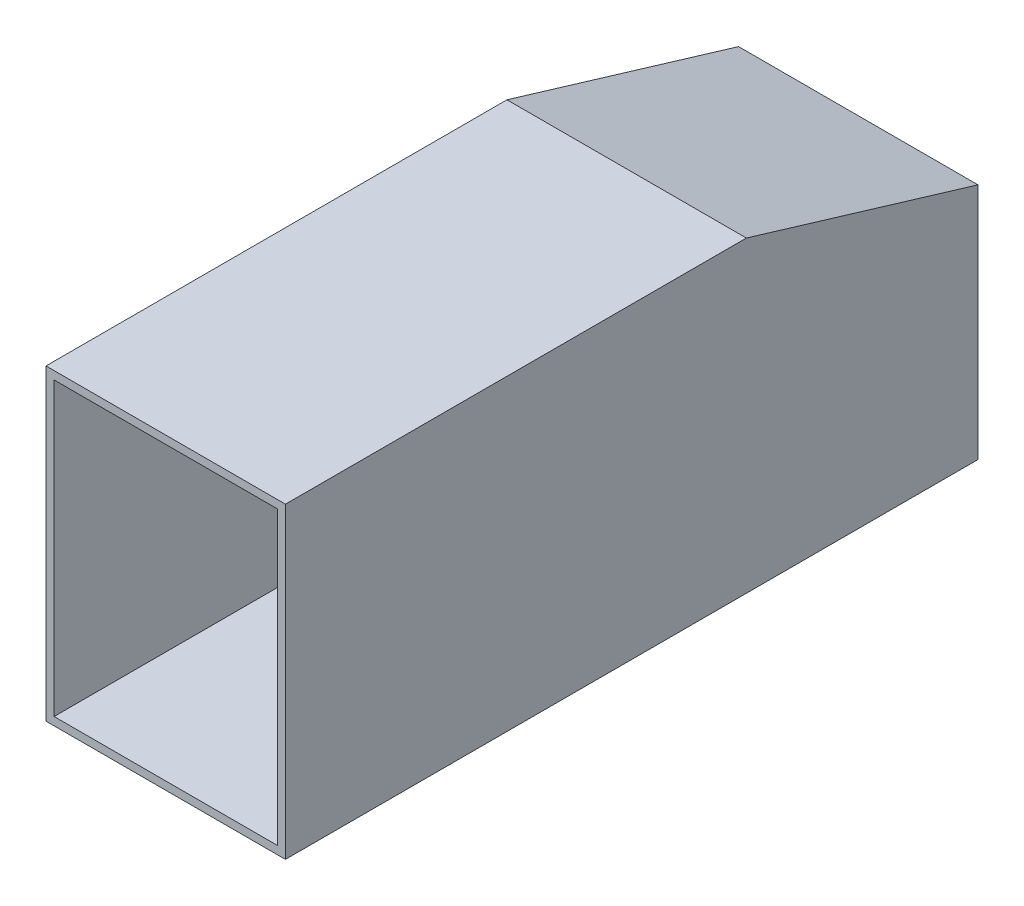
ISO-10303-21;
HEADER;
FILE_DESCRIPTION(('STEP AP214'),'2;1');
FILE_NAME('part.step','',(''),(''),'','','');
FILE_SCHEMA(('AUTOMOTIVE_DESIGN { 1 0 10303 214 1 1 1 1 }'));
ENDSEC;
DATA;
#1=APPLICATION_CONTEXT('core data for automotive mechanical design processes');
#2=APPLICATION_PROTOCOL_DEFINITION('international standard','automotive_design',2000,#1);
#3=PRODUCT_CONTEXT('',#1,'mechanical');
#4=PRODUCT('Part','Part','',(#3));
#5=PRODUCT_RELATED_PRODUCT_CATEGORY('part','',(#4));
#6=PRODUCT_DEFINITION_FORMATION('','',#4);
#7=PRODUCT_DEFINITION_CONTEXT('part definition',#1,'design');
#8=PRODUCT_DEFINITION('design','',#6,#7);
#9=PRODUCT_DEFINITION_SHAPE('','',#8);
#10=(LENGTH_UNIT() NAMED_UNIT(*) SI_UNIT(.MILLI.,.METRE.));
#11=(NAMED_UNIT(*) PLANE_ANGLE_UNIT() SI_UNIT($,.RADIAN.));
#12=(NAMED_UNIT(*) SI_UNIT($,.STERADIAN.) SOLID_ANGLE_UNIT());
#13=UNCERTAINTY_MEASURE_WITH_UNIT(LENGTH_MEASURE(1.E-05),#10,'distance_accuracy_value','');
#14=(GEOMETRIC_REPRESENTATION_CONTEXT(3) GLOBAL_UNCERTAINTY_ASSIGNED_CONTEXT((#13)) GLOBAL_UNIT_ASSIGNED_CONTEXT((#10,
#11,#12)) REPRESENTATION_CONTEXT('',''));
#15=CARTESIAN_POINT('',(0.,0.,0.));
#16=DIRECTION('',(0.,0.,1.));
#17=DIRECTION('',(1.,0.,0.));
#18=AXIS2_PLACEMENT_3D('',#15,#16,#17);
#19=CARTESIAN_POINT('',(0.,139.954,-407.3906));
#20=DIRECTION('',(0.,0.,-1.));
#21=DIRECTION('',(-1.,0.,0.));
#22=AXIS2_PLACEMENT_3D('',#19,#20,#21);
#23=PLANE('',#22);
#24=DIRECTION('',(0.,1.,0.));
#25=VECTOR('',#24,1.);
#26=CARTESIAN_POINT('',(140.843,139.954,-407.3906));
#27=LINE('',#26,#25);
#28=CARTESIAN_POINT('',(140.843,0.,-407.3906));
#29=VERTEX_POINT('',#28);
#30=CARTESIAN_POINT('',(140.843,139.954,-407.3906));
#31=VERTEX_POINT('',#30);
#32=EDGE_CURVE('E142',#29,#31,#27,.T.);
#33=ORIENTED_EDGE('',*,*,#32,.F.);
#34=DIRECTION('',(1.,0.,0.));
#35=VECTOR('',#34,1.);
#36=CARTESIAN_POINT('',(0.,0.,-407.3906));
#37=LINE('',#36,#35);
#38=CARTESIAN_POINT('',(0.,0.,-407.3906));
#39=VERTEX_POINT('',#38);
#40=EDGE_CURVE('E150',#39,#29,#37,.T.);
#41=ORIENTED_EDGE('',*,*,#40,.F.);
#42=DIRECTION('',(0.,1.,0.));
#43=VECTOR('',#42,1.);
#44=CARTESIAN_POINT('',(0.,139.954,-407.3906));
#45=LINE('',#44,#43);
#46=CARTESIAN_POINT('',(0.,139.954,-407.3906));
#47=VERTEX_POINT('',#46);
#48=EDGE_CURVE('E143',#39,#47,#45,.T.);
#49=ORIENTED_EDGE('',*,*,#48,.T.);
#50=DIRECTION('',(1.,0.,0.));
#51=VECTOR('',#50,1.);
#52=CARTESIAN_POINT('',(0.,139.954,-407.3906));
#53=LINE('',#52,#51);
#54=EDGE_CURVE('E155',#47,#31,#53,.T.);
#55=ORIENTED_EDGE('',*,*,#54,.T.);
#56=EDGE_LOOP('',(#33,#41,#49,#55));
#57=FACE_BOUND('',#56,.T.);
#58=DIRECTION('',(1.,0.,0.));
#59=VECTOR('',#58,1.);
#60=CARTESIAN_POINT('',(0.,4.7625,-407.3906));
#61=LINE('',#60,#59);
#62=CARTESIAN_POINT('',(4.7625,4.7625,-407.3906));
#63=VERTEX_POINT('',#62);
#64=CARTESIAN_POINT('',(136.0805,4.7625,-407.3906));
#65=VERTEX_POINT('',#64);
#66=EDGE_CURVE('E123',#63,#65,#61,.T.);
#67=ORIENTED_EDGE('',*,*,#66,.T.);
#68=DIRECTION('',(0.,1.,0.));
#69=VECTOR('',#68,1.);
#70=CARTESIAN_POINT('',(136.0805,139.954,-407.3906));
#71=LINE('',#70,#69);
#72=CARTESIAN_POINT('',(136.0805,134.980321850254,-407.3906));
#73=VERTEX_POINT('',#72);
#74=EDGE_CURVE('E135',#65,#73,#71,.T.);
#75=ORIENTED_EDGE('',*,*,#74,.T.);
#76=DIRECTION('',(1.,0.,0.));
#77=VECTOR('',#76,1.);
#78=CARTESIAN_POINT('',(0.,134.980321850254,-407.3906));
#79=LINE('',#78,#77);
#80=CARTESIAN_POINT('',(4.7625,134.980321850254,-407.3906));
#81=VERTEX_POINT('',#80);
#82=EDGE_CURVE('E128',#81,#73,#79,.T.);
#83=ORIENTED_EDGE('',*,*,#82,.F.);
#84=DIRECTION('',(0.,1.,0.));
#85=VECTOR('',#84,1.);
#86=CARTESIAN_POINT('',(4.7625,139.954,-407.3906));
#87=LINE('',#86,#85);
#88=EDGE_CURVE('E48',#63,#81,#87,.T.);
#89=ORIENTED_EDGE('',*,*,#88,.F.);
#90=EDGE_LOOP('',(#67,#75,#83,#89));
#91=FACE_BOUND('',#90,.T.);
#92=ADVANCED_FACE('F33',(#57,#91),#23,.T.);
#93=CARTESIAN_POINT('',(140.843,0.,0.));
#94=DIRECTION('',(0.,0.,-1.));
#95=DIRECTION('',(-1.,0.,0.));
#96=AXIS2_PLACEMENT_3D('',#93,#94,#95);
#97=PLANE('',#96);
#98=DIRECTION('',(1.,0.,0.));
#99=VECTOR('',#98,1.);
#100=CARTESIAN_POINT('',(4.76250000000002,4.7625,0.));
#101=LINE('',#100,#99);
#102=CARTESIAN_POINT('',(4.76250000000003,4.7625,0.));
#103=VERTEX_POINT('',#102);
#104=CARTESIAN_POINT('',(136.0805,4.7625,0.));
#105=VERTEX_POINT('',#104);
#106=EDGE_CURVE('E168',#103,#105,#101,.T.);
#107=ORIENTED_EDGE('',*,*,#106,.F.);
#108=DIRECTION('',(0.,-1.,0.));
#109=VECTOR('',#108,1.);
#110=CARTESIAN_POINT('',(4.7625,176.2125,0.));
#111=LINE('',#110,#109);
#112=CARTESIAN_POINT('',(4.7625,176.2125,0.));
#113=VERTEX_POINT('',#112);
#114=EDGE_CURVE('E54',#113,#103,#111,.T.);
#115=ORIENTED_EDGE('',*,*,#114,.F.);
#116=DIRECTION('',(-1.,0.,0.));
#117=VECTOR('',#116,1.);
#118=CARTESIAN_POINT('',(4.7625,176.2125,0.));
#119=LINE('',#118,#117);
#120=CARTESIAN_POINT('',(136.0805,176.2125,0.));
#121=VERTEX_POINT('',#120);
#122=EDGE_CURVE('E163',#121,#113,#119,.T.);
#123=ORIENTED_EDGE('',*,*,#122,.F.);
#124=DIRECTION('',(0.,1.,0.));
#125=VECTOR('',#124,1.);
#126=CARTESIAN_POINT('',(136.0805,176.2125,0.));
#127=LINE('',#126,#125);
#128=EDGE_CURVE('E170',#105,#121,#127,.T.);
#129=ORIENTED_EDGE('',*,*,#128,.F.);
#130=EDGE_LOOP('',(#107,#115,#123,#129));
#131=FACE_BOUND('',#130,.T.);
#132=DIRECTION('',(0.,-1.,0.));
#133=VECTOR('',#132,1.);
#134=CARTESIAN_POINT('',(0.,0.,0.));
#135=LINE('',#134,#133);
#136=CARTESIAN_POINT('',(0.,180.975,0.));
#137=VERTEX_POINT('',#136);
#138=CARTESIAN_POINT('',(0.,0.,0.));
#139=VERTEX_POINT('',#138);
#140=EDGE_CURVE('E177',#137,#139,#135,.T.);
#141=ORIENTED_EDGE('',*,*,#140,.T.);
#142=DIRECTION('',(-1.,0.,0.));
#143=VECTOR('',#142,1.);
#144=CARTESIAN_POINT('',(140.843,0.,0.));
#145=LINE('',#144,#143);
#146=CARTESIAN_POINT('',(140.843,0.,0.));
#147=VERTEX_POINT('',#146);
#148=EDGE_CURVE('E11',#147,#139,#145,.T.);
#149=ORIENTED_EDGE('',*,*,#148,.F.);
#150=DIRECTION('',(0.,-1.,0.));
#151=VECTOR('',#150,1.);
#152=CARTESIAN_POINT('',(140.843,0.,0.));
#153=LINE('',#152,#151);
#154=CARTESIAN_POINT('',(140.843,180.975,0.));
#155=VERTEX_POINT('',#154);
#156=EDGE_CURVE('E181',#155,#147,#153,.T.);
#157=ORIENTED_EDGE('',*,*,#156,.F.);
#158=DIRECTION('',(-1.,0.,0.));
#159=VECTOR('',#158,1.);
#160=CARTESIAN_POINT('',(140.843,180.975,0.));
#161=LINE('',#160,#159);
#162=EDGE_CURVE('E189',#155,#137,#161,.T.);
#163=ORIENTED_EDGE('',*,*,#162,.T.);
#164=EDGE_LOOP('',(#141,#149,#157,#163));
#165=FACE_BOUND('',#164,.T.);
#166=ADVANCED_FACE('F35',(#131,#165),#97,.F.);
#167=CARTESIAN_POINT('',(140.843,0.,0.));
#168=DIRECTION('',(0.,1.,0.));
#169=DIRECTION('',(0.,0.,1.));
#170=AXIS2_PLACEMENT_3D('',#167,#168,#169);
#171=PLANE('',#170);
#172=DIRECTION('',(0.,0.,-1.));
#173=VECTOR('',#172,1.);
#174=CARTESIAN_POINT('',(0.,0.,0.));
#175=LINE('',#174,#173);
#176=EDGE_CURVE('E192',#139,#39,#175,.T.);
#177=ORIENTED_EDGE('',*,*,#176,.T.);
#178=ORIENTED_EDGE('',*,*,#40,.T.);
#179=DIRECTION('',(0.,0.,-1.));
#180=VECTOR('',#179,1.);
#181=CARTESIAN_POINT('',(140.843,0.,0.));
#182=LINE('',#181,#180);
#183=EDGE_CURVE('E184',#147,#29,#182,.T.);
#184=ORIENTED_EDGE('',*,*,#183,.F.);
#185=ORIENTED_EDGE('',*,*,#148,.T.);
#186=EDGE_LOOP('',(#177,#178,#184,#185));
#187=FACE_BOUND('',#186,.T.);
#188=ADVANCED_FACE('F213',(#187),#171,.F.);
#189=CARTESIAN_POINT('',(140.843,180.975,0.));
#190=DIRECTION('',(0.,-1.,0.));
#191=DIRECTION('',(0.,0.,-1.));
#192=AXIS2_PLACEMENT_3D('',#189,#190,#191);
#193=PLANE('',#192);
#194=DIRECTION('',(0.,0.,1.));
#195=VECTOR('',#194,1.);
#196=CARTESIAN_POINT('',(0.,180.975,0.));
#197=LINE('',#196,#195);
#198=CARTESIAN_POINT('',(0.,180.975,-271.145));
#199=VERTEX_POINT('',#198);
#200=EDGE_CURVE('E185',#199,#137,#197,.T.);
#201=ORIENTED_EDGE('',*,*,#200,.T.);
#202=ORIENTED_EDGE('',*,*,#162,.F.);
#203=DIRECTION('',(0.,0.,1.));
#204=VECTOR('',#203,1.);
#205=CARTESIAN_POINT('',(140.843,180.975,0.));
#206=LINE('',#205,#204);
#207=CARTESIAN_POINT('',(140.843,180.975,-271.145));
#208=VERTEX_POINT('',#207);
#209=EDGE_CURVE('E187',#208,#155,#206,.T.);
#210=ORIENTED_EDGE('',*,*,#209,.F.);
#211=DIRECTION('',(-1.,0.,0.));
#212=VECTOR('',#211,1.);
#213=CARTESIAN_POINT('',(140.843,180.975,-271.145));
#214=LINE('',#213,#212);
#215=EDGE_CURVE('E41',#208,#199,#214,.T.);
#216=ORIENTED_EDGE('',*,*,#215,.T.);
#217=EDGE_LOOP('',(#201,#202,#210,#216));
#218=FACE_BOUND('',#217,.T.);
#219=ADVANCED_FACE('F199',(#218),#193,.F.);
#220=CARTESIAN_POINT('',(140.843,0.,0.));
#221=DIRECTION('',(-1.,0.,0.));
#222=DIRECTION('',(0.,0.,1.));
#223=AXIS2_PLACEMENT_3D('',#220,#221,#222);
#224=PLANE('',#223);
#225=ORIENTED_EDGE('',*,*,#156,.T.);
#226=ORIENTED_EDGE('',*,*,#183,.T.);
#227=ORIENTED_EDGE('',*,*,#32,.T.);
#228=DIRECTION('',(0.,0.288297627094021,0.957540849369862));
#229=VECTOR('',#228,1.);
#230=CARTESIAN_POINT('',(140.843,180.975,-271.145));
#231=LINE('',#230,#229);
#232=EDGE_CURVE('E147',#31,#208,#231,.T.);
#233=ORIENTED_EDGE('',*,*,#232,.T.);
#234=ORIENTED_EDGE('',*,*,#209,.T.);
#235=EDGE_LOOP('',(#225,#226,#227,#233,#234));
#236=FACE_BOUND('',#235,.T.);
#237=ADVANCED_FACE('F218',(#236),#224,.F.);
#238=CARTESIAN_POINT('',(0.,0.,0.));
#239=DIRECTION('',(-1.,0.,0.));
#240=DIRECTION('',(0.,0.,1.));
#241=AXIS2_PLACEMENT_3D('',#238,#239,#240);
#242=PLANE('',#241);
#243=ORIENTED_EDGE('',*,*,#140,.F.);
#244=ORIENTED_EDGE('',*,*,#200,.F.);
#245=DIRECTION('',(0.,0.288297627094021,0.957540849369862));
#246=VECTOR('',#245,1.);
#247=CARTESIAN_POINT('',(0.,180.975,-271.145));
#248=LINE('',#247,#246);
#249=EDGE_CURVE('E146',#47,#199,#248,.T.);
#250=ORIENTED_EDGE('',*,*,#249,.F.);
#251=ORIENTED_EDGE('',*,*,#48,.F.);
#252=ORIENTED_EDGE('',*,*,#176,.F.);
#253=EDGE_LOOP('',(#243,#244,#250,#251,#252));
#254=FACE_BOUND('',#253,.T.);
#255=ADVANCED_FACE('F208',(#254),#242,.T.);
#256=CARTESIAN_POINT('',(4.7625,176.2125,-271.145));
#257=DIRECTION('',(-1.,0.,0.));
#258=DIRECTION('',(0.,-1.,0.));
#259=AXIS2_PLACEMENT_3D('',#256,#257,#258);
#260=PLANE('',#259);
#261=ORIENTED_EDGE('',*,*,#114,.T.);
#262=DIRECTION('',(0.,0.,1.));
#263=VECTOR('',#262,1.);
#264=CARTESIAN_POINT('',(4.76250000000002,4.7625,-271.145));
#265=LINE('',#264,#263);
#266=EDGE_CURVE('E113',#63,#103,#265,.T.);
#267=ORIENTED_EDGE('',*,*,#266,.F.);
#268=ORIENTED_EDGE('',*,*,#88,.T.);
#269=DIRECTION('',(0.,0.288297627094021,0.957540849369862));
#270=VECTOR('',#269,1.);
#271=CARTESIAN_POINT('',(4.7625,176.414711704876,-269.771982550965));
#272=LINE('',#271,#270);
#273=CARTESIAN_POINT('',(4.7625,176.001321850254,-271.145));
#274=VERTEX_POINT('',#273);
#275=EDGE_CURVE('E129',#81,#274,#272,.T.);
#276=ORIENTED_EDGE('',*,*,#275,.T.);
#277=DIRECTION('',(0.,-1.,0.));
#278=VECTOR('',#277,1.);
#279=CARTESIAN_POINT('',(4.7625,176.2125,-271.145));
#280=LINE('',#279,#278);
#281=CARTESIAN_POINT('',(4.7625,176.2125,-271.145));
#282=VERTEX_POINT('',#281);
#283=EDGE_CURVE('E159',#282,#274,#280,.T.);
#284=ORIENTED_EDGE('',*,*,#283,.F.);
#285=DIRECTION('',(0.,0.,1.));
#286=VECTOR('',#285,1.);
#287=CARTESIAN_POINT('',(4.7625,176.2125,-271.145));
#288=LINE('',#287,#286);
#289=EDGE_CURVE('E175',#282,#113,#288,.T.);
#290=ORIENTED_EDGE('',*,*,#289,.T.);
#291=EDGE_LOOP('',(#261,#267,#268,#276,#284,#290));
#292=FACE_BOUND('',#291,.T.);
#293=ADVANCED_FACE('F115',(#292),#260,.F.);
#294=CARTESIAN_POINT('',(4.7625,176.2125,-271.145));
#295=DIRECTION('',(0.,1.,0.));
#296=DIRECTION('',(0.,0.,1.));
#297=AXIS2_PLACEMENT_3D('',#294,#295,#296);
#298=PLANE('',#297);
#299=ORIENTED_EDGE('',*,*,#122,.T.);
#300=ORIENTED_EDGE('',*,*,#289,.F.);
#301=DIRECTION('',(-1.,0.,0.));
#302=VECTOR('',#301,1.);
#303=CARTESIAN_POINT('',(4.7625,176.2125,-271.145));
#304=LINE('',#303,#302);
#305=CARTESIAN_POINT('',(136.0805,176.2125,-271.145));
#306=VERTEX_POINT('',#305);
#307=EDGE_CURVE('E120',#306,#282,#304,.T.);
#308=ORIENTED_EDGE('',*,*,#307,.F.);
#309=DIRECTION('',(0.,0.,1.));
#310=VECTOR('',#309,1.);
#311=CARTESIAN_POINT('',(136.0805,176.2125,-271.145));
#312=LINE('',#311,#310);
#313=EDGE_CURVE('E178',#306,#121,#312,.T.);
#314=ORIENTED_EDGE('',*,*,#313,.T.);
#315=EDGE_LOOP('',(#299,#300,#308,#314));
#316=FACE_BOUND('',#315,.T.);
#317=ADVANCED_FACE('F237',(#316),#298,.F.);
#318=CARTESIAN_POINT('',(136.0805,176.2125,-271.145));
#319=DIRECTION('',(1.,0.,0.));
#320=DIRECTION('',(0.,1.,0.));
#321=AXIS2_PLACEMENT_3D('',#318,#319,#320);
#322=PLANE('',#321);
#323=ORIENTED_EDGE('',*,*,#128,.T.);
#324=ORIENTED_EDGE('',*,*,#313,.F.);
#325=DIRECTION('',(0.,1.,0.));
#326=VECTOR('',#325,1.);
#327=CARTESIAN_POINT('',(136.0805,176.2125,-271.145));
#328=LINE('',#327,#326);
#329=CARTESIAN_POINT('',(136.0805,176.001321850254,-271.145));
#330=VERTEX_POINT('',#329);
#331=EDGE_CURVE('E162',#330,#306,#328,.T.);
#332=ORIENTED_EDGE('',*,*,#331,.F.);
#333=DIRECTION('',(0.,0.288297627094021,0.957540849369862));
#334=VECTOR('',#333,1.);
#335=CARTESIAN_POINT('',(136.0805,176.414711704876,-269.771982550965));
#336=LINE('',#335,#334);
#337=EDGE_CURVE('E132',#73,#330,#336,.T.);
#338=ORIENTED_EDGE('',*,*,#337,.F.);
#339=ORIENTED_EDGE('',*,*,#74,.F.);
#340=DIRECTION('',(0.,0.,1.));
#341=VECTOR('',#340,1.);
#342=CARTESIAN_POINT('',(136.0805,4.7625,-271.145));
#343=LINE('',#342,#341);
#344=EDGE_CURVE('E119',#65,#105,#343,.T.);
#345=ORIENTED_EDGE('',*,*,#344,.T.);
#346=EDGE_LOOP('',(#323,#324,#332,#338,#339,#345));
#347=FACE_BOUND('',#346,.T.);
#348=ADVANCED_FACE('F240',(#347),#322,.F.);
#349=CARTESIAN_POINT('',(4.76250000000002,4.7625,-271.145));
#350=DIRECTION('',(0.,-1.,0.));
#351=DIRECTION('',(0.,0.,-1.));
#352=AXIS2_PLACEMENT_3D('',#349,#350,#351);
#353=PLANE('',#352);
#354=ORIENTED_EDGE('',*,*,#106,.T.);
#355=ORIENTED_EDGE('',*,*,#344,.F.);
#356=ORIENTED_EDGE('',*,*,#66,.F.);
#357=ORIENTED_EDGE('',*,*,#266,.T.);
#358=EDGE_LOOP('',(#354,#355,#356,#357));
#359=FACE_BOUND('',#358,.T.);
#360=ADVANCED_FACE('F124',(#359),#353,.F.);
#361=CARTESIAN_POINT('',(0.,180.975,-271.145));
#362=DIRECTION('',(0.,0.,1.));
#363=DIRECTION('',(1.,0.,0.));
#364=AXIS2_PLACEMENT_3D('',#361,#362,#363);
#365=PLANE('',#364);
#366=DIRECTION('',(-1.,0.,0.));
#367=VECTOR('',#366,1.);
#368=CARTESIAN_POINT('',(0.,176.001321850254,-271.145));
#369=LINE('',#368,#367);
#370=EDGE_CURVE('E139',#330,#274,#369,.T.);
#371=ORIENTED_EDGE('',*,*,#370,.F.);
#372=ORIENTED_EDGE('',*,*,#331,.T.);
#373=ORIENTED_EDGE('',*,*,#307,.T.);
#374=ORIENTED_EDGE('',*,*,#283,.T.);
#375=EDGE_LOOP('',(#371,#372,#373,#374));
#376=FACE_BOUND('',#375,.T.);
#377=ADVANCED_FACE('F246',(#376),#365,.T.);
#378=CARTESIAN_POINT('',(0.,180.975,-271.145));
#379=DIRECTION('',(0.,0.957540849369862,-0.288297627094021));
#380=DIRECTION('',(0.,0.288297627094021,0.957540849369862));
#381=AXIS2_PLACEMENT_3D('',#378,#379,#380);
#382=PLANE('',#381);
#383=ORIENTED_EDGE('',*,*,#232,.F.);
#384=ORIENTED_EDGE('',*,*,#54,.F.);
#385=ORIENTED_EDGE('',*,*,#249,.T.);
#386=ORIENTED_EDGE('',*,*,#215,.F.);
#387=EDGE_LOOP('',(#383,#384,#385,#386));
#388=FACE_BOUND('',#387,.T.);
#389=ADVANCED_FACE('F204',(#388),#382,.T.);
#390=CARTESIAN_POINT('',(0.,176.414711704876,-269.771982550965));
#391=DIRECTION('',(0.,0.957540849369862,-0.288297627094021));
#392=DIRECTION('',(0.,0.288297627094021,0.957540849369862));
#393=AXIS2_PLACEMENT_3D('',#390,#391,#392);
#394=PLANE('',#393);
#395=ORIENTED_EDGE('',*,*,#370,.T.);
#396=ORIENTED_EDGE('',*,*,#275,.F.);
#397=ORIENTED_EDGE('',*,*,#82,.T.);
#398=ORIENTED_EDGE('',*,*,#337,.T.);
#399=EDGE_LOOP('',(#395,#396,#397,#398));
#400=FACE_BOUND('',#399,.T.);
#401=ADVANCED_FACE('F277',(#400),#394,.F.);
#402=CLOSED_SHELL('',(#92,#166,#188,#219,#237,#255,#293,#317,#348,#360,#377,#389,#401));
#403=MANIFOLD_SOLID_BREP('B2',#402);
#404=ADVANCED_BREP_SHAPE_REPRESENTATION('',(#18,#403),#14);
#405=SHAPE_DEFINITION_REPRESENTATION(#9,#404);
ENDSEC;
END-ISO-10303-21;
